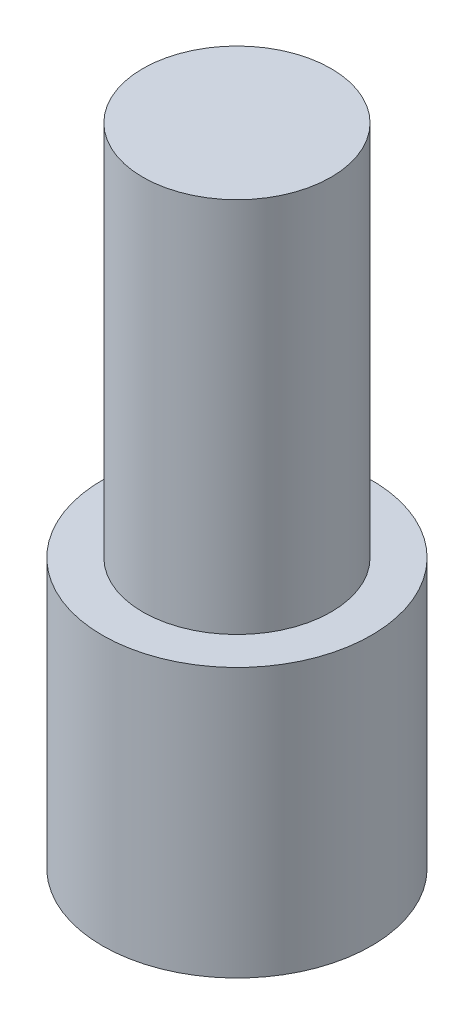
ISO-10303-21;
HEADER;
FILE_DESCRIPTION(('STEP AP214'),'2;1');
FILE_NAME('part.step','',(''),(''),'','','');
FILE_SCHEMA(('AUTOMOTIVE_DESIGN { 1 0 10303 214 1 1 1 1 }'));
ENDSEC;
DATA;
#1=APPLICATION_CONTEXT('core data for automotive mechanical design processes');
#2=APPLICATION_PROTOCOL_DEFINITION('international standard','automotive_design',2000,#1);
#3=PRODUCT_CONTEXT('',#1,'mechanical');
#4=PRODUCT('Part','Part','',(#3));
#5=PRODUCT_RELATED_PRODUCT_CATEGORY('part','',(#4));
#6=PRODUCT_DEFINITION_FORMATION('','',#4);
#7=PRODUCT_DEFINITION_CONTEXT('part definition',#1,'design');
#8=PRODUCT_DEFINITION('design','',#6,#7);
#9=PRODUCT_DEFINITION_SHAPE('','',#8);
#10=(LENGTH_UNIT() NAMED_UNIT(*) SI_UNIT(.MILLI.,.METRE.));
#11=(NAMED_UNIT(*) PLANE_ANGLE_UNIT() SI_UNIT($,.RADIAN.));
#12=(NAMED_UNIT(*) SI_UNIT($,.STERADIAN.) SOLID_ANGLE_UNIT());
#13=UNCERTAINTY_MEASURE_WITH_UNIT(LENGTH_MEASURE(1.E-05),#10,'distance_accuracy_value','');
#14=(GEOMETRIC_REPRESENTATION_CONTEXT(3) GLOBAL_UNCERTAINTY_ASSIGNED_CONTEXT((#13)) GLOBAL_UNIT_ASSIGNED_CONTEXT((#10,
#11,#12)) REPRESENTATION_CONTEXT('',''));
#15=CARTESIAN_POINT('',(0.,0.,0.));
#16=DIRECTION('',(0.,0.,1.));
#17=DIRECTION('',(1.,0.,0.));
#18=AXIS2_PLACEMENT_3D('',#15,#16,#17);
#19=CARTESIAN_POINT('',(0.,5.,0.));
#20=DIRECTION('',(0.,1.,0.));
#21=DIRECTION('',(0.,0.,1.));
#22=AXIS2_PLACEMENT_3D('',#19,#20,#21);
#23=PLANE('',#22);
#24=CARTESIAN_POINT('',(0.,5.,0.));
#25=DIRECTION('',(0.,1.,0.));
#26=DIRECTION('',(0.,0.,1.));
#27=AXIS2_PLACEMENT_3D('',#24,#25,#26);
#28=CIRCLE('',#27,2.5);
#29=CARTESIAN_POINT('',(0.,5.,2.5));
#30=VERTEX_POINT('',#29);
#31=EDGE_CURVE('E10',#30,#30,#28,.T.);
#32=ORIENTED_EDGE('',*,*,#31,.T.);
#33=EDGE_LOOP('',(#32));
#34=FACE_BOUND('',#33,.T.);
#35=CARTESIAN_POINT('',(0.,5.,0.));
#36=DIRECTION('',(0.,1.,0.));
#37=DIRECTION('',(0.,0.,1.));
#38=AXIS2_PLACEMENT_3D('',#35,#36,#37);
#39=CIRCLE('',#38,1.75);
#40=CARTESIAN_POINT('',(0.,5.,1.75));
#41=VERTEX_POINT('',#40);
#42=EDGE_CURVE('E44',#41,#41,#39,.T.);
#43=ORIENTED_EDGE('',*,*,#42,.F.);
#44=EDGE_LOOP('',(#43));
#45=FACE_BOUND('',#44,.T.);
#46=ADVANCED_FACE('F31',(#34,#45),#23,.T.);
#47=CARTESIAN_POINT('',(0.,5.,0.));
#48=DIRECTION('',(0.,-1.,0.));
#49=DIRECTION('',(0.,0.,-1.));
#50=AXIS2_PLACEMENT_3D('',#47,#48,#49);
#51=CYLINDRICAL_SURFACE('',#50,2.5);
#52=ORIENTED_EDGE('',*,*,#31,.F.);
#53=EDGE_LOOP('',(#52));
#54=FACE_BOUND('',#53,.T.);
#55=CARTESIAN_POINT('',(0.,0.,0.));
#56=DIRECTION('',(0.,1.,0.));
#57=DIRECTION('',(0.,0.,1.));
#58=AXIS2_PLACEMENT_3D('',#55,#56,#57);
#59=CIRCLE('',#58,2.5);
#60=CARTESIAN_POINT('',(0.,0.,2.5));
#61=VERTEX_POINT('',#60);
#62=EDGE_CURVE('E35',#61,#61,#59,.T.);
#63=ORIENTED_EDGE('',*,*,#62,.T.);
#64=EDGE_LOOP('',(#63));
#65=FACE_BOUND('',#64,.T.);
#66=ADVANCED_FACE('F33',(#54,#65),#51,.T.);
#67=CARTESIAN_POINT('',(0.,0.,0.));
#68=DIRECTION('',(0.,1.,0.));
#69=DIRECTION('',(0.,0.,1.));
#70=AXIS2_PLACEMENT_3D('',#67,#68,#69);
#71=PLANE('',#70);
#72=CARTESIAN_POINT('',(0.,0.,0.));
#73=DIRECTION('',(0.,-1.,0.));
#74=DIRECTION('',(0.,0.,-1.));
#75=AXIS2_PLACEMENT_3D('',#72,#73,#74);
#76=CIRCLE('',#75,1.75);
#77=CARTESIAN_POINT('',(0.,0.,-1.75));
#78=VERTEX_POINT('',#77);
#79=EDGE_CURVE('E50',#78,#78,#76,.T.);
#80=ORIENTED_EDGE('',*,*,#79,.F.);
#81=EDGE_LOOP('',(#80));
#82=FACE_BOUND('',#81,.T.);
#83=ORIENTED_EDGE('',*,*,#62,.F.);
#84=EDGE_LOOP('',(#83));
#85=FACE_BOUND('',#84,.T.);
#86=ADVANCED_FACE('F65',(#82,#85),#71,.F.);
#87=CARTESIAN_POINT('',(0.,12.,0.));
#88=DIRECTION('',(0.,-1.,0.));
#89=DIRECTION('',(0.,0.,-1.));
#90=AXIS2_PLACEMENT_3D('',#87,#88,#89);
#91=CYLINDRICAL_SURFACE('',#90,1.75);
#92=CARTESIAN_POINT('',(0.,12.,0.));
#93=DIRECTION('',(0.,1.,0.));
#94=DIRECTION('',(0.,0.,1.));
#95=AXIS2_PLACEMENT_3D('',#92,#93,#94);
#96=CIRCLE('',#95,1.75);
#97=CARTESIAN_POINT('',(0.,12.,1.75));
#98=VERTEX_POINT('',#97);
#99=EDGE_CURVE('E42',#98,#98,#96,.T.);
#100=ORIENTED_EDGE('',*,*,#99,.F.);
#101=EDGE_LOOP('',(#100));
#102=FACE_BOUND('',#101,.T.);
#103=ORIENTED_EDGE('',*,*,#42,.T.);
#104=EDGE_LOOP('',(#103));
#105=FACE_BOUND('',#104,.T.);
#106=ADVANCED_FACE('F68',(#102,#105),#91,.T.);
#107=CARTESIAN_POINT('',(0.,12.,0.));
#108=DIRECTION('',(0.,1.,0.));
#109=DIRECTION('',(0.,0.,1.));
#110=AXIS2_PLACEMENT_3D('',#107,#108,#109);
#111=PLANE('',#110);
#112=ORIENTED_EDGE('',*,*,#99,.T.);
#113=EDGE_LOOP('',(#112));
#114=FACE_BOUND('',#113,.T.);
#115=ADVANCED_FACE('F61',(#114),#111,.T.);
#116=CARTESIAN_POINT('',(0.,3.,0.));
#117=DIRECTION('',(0.,-1.,0.));
#118=DIRECTION('',(0.,0.,-1.));
#119=AXIS2_PLACEMENT_3D('',#116,#117,#118);
#120=CYLINDRICAL_SURFACE('',#119,1.75);
#121=CARTESIAN_POINT('',(0.,3.,0.));
#122=DIRECTION('',(0.,-1.,0.));
#123=DIRECTION('',(0.,0.,-1.));
#124=AXIS2_PLACEMENT_3D('',#121,#122,#123);
#125=CIRCLE('',#124,1.75);
#126=CARTESIAN_POINT('',(0.,3.,-1.75));
#127=VERTEX_POINT('',#126);
#128=EDGE_CURVE('E47',#127,#127,#125,.T.);
#129=ORIENTED_EDGE('',*,*,#128,.F.);
#130=EDGE_LOOP('',(#129));
#131=FACE_BOUND('',#130,.T.);
#132=ORIENTED_EDGE('',*,*,#79,.T.);
#133=EDGE_LOOP('',(#132));
#134=FACE_BOUND('',#133,.T.);
#135=ADVANCED_FACE('F58',(#131,#134),#120,.F.);
#136=CARTESIAN_POINT('',(0.,3.,0.));
#137=DIRECTION('',(0.,-1.,0.));
#138=DIRECTION('',(0.,0.,-1.));
#139=AXIS2_PLACEMENT_3D('',#136,#137,#138);
#140=PLANE('',#139);
#141=ORIENTED_EDGE('',*,*,#128,.T.);
#142=EDGE_LOOP('',(#141));
#143=FACE_BOUND('',#142,.T.);
#144=ADVANCED_FACE('F56',(#143),#140,.T.);
#145=CLOSED_SHELL('',(#46,#66,#86,#106,#115,#135,#144));
#146=MANIFOLD_SOLID_BREP('B2',#145);
#147=ADVANCED_BREP_SHAPE_REPRESENTATION('',(#18,#146),#14);
#148=SHAPE_DEFINITION_REPRESENTATION(#9,#147);
ENDSEC;
END-ISO-10303-21;
